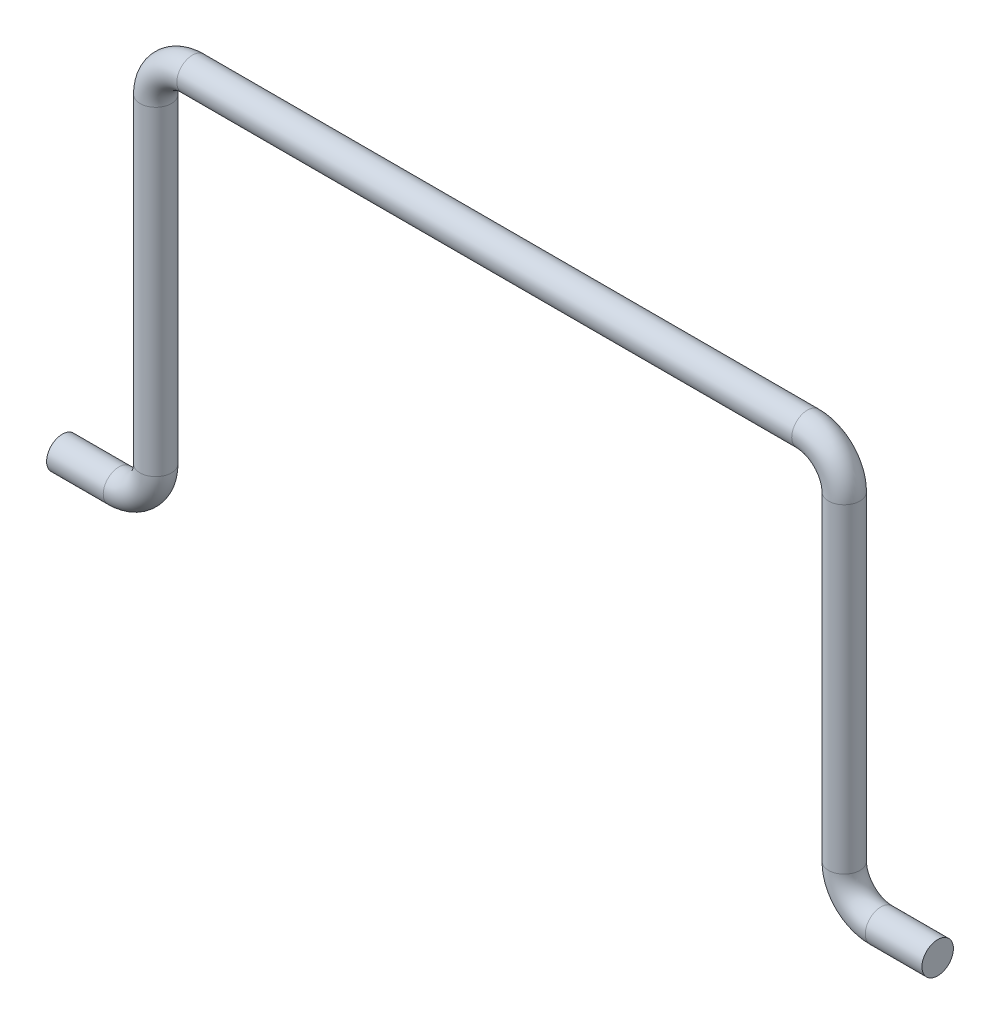
ISO-10303-21;
HEADER;
FILE_DESCRIPTION(('STEP AP214'),'2;1');
FILE_NAME('part.step','',(''),(''),'','','');
FILE_SCHEMA(('AUTOMOTIVE_DESIGN { 1 0 10303 214 1 1 1 1 }'));
ENDSEC;
DATA;
#1=APPLICATION_CONTEXT('core data for automotive mechanical design processes');
#2=APPLICATION_PROTOCOL_DEFINITION('international standard','automotive_design',2000,#1);
#3=PRODUCT_CONTEXT('',#1,'mechanical');
#4=PRODUCT('Part','Part','',(#3));
#5=PRODUCT_RELATED_PRODUCT_CATEGORY('part','',(#4));
#6=PRODUCT_DEFINITION_FORMATION('','',#4);
#7=PRODUCT_DEFINITION_CONTEXT('part definition',#1,'design');
#8=PRODUCT_DEFINITION('design','',#6,#7);
#9=PRODUCT_DEFINITION_SHAPE('','',#8);
#10=(LENGTH_UNIT() NAMED_UNIT(*) SI_UNIT(.MILLI.,.METRE.));
#11=(NAMED_UNIT(*) PLANE_ANGLE_UNIT() SI_UNIT($,.RADIAN.));
#12=(NAMED_UNIT(*) SI_UNIT($,.STERADIAN.) SOLID_ANGLE_UNIT());
#13=UNCERTAINTY_MEASURE_WITH_UNIT(LENGTH_MEASURE(1.E-05),#10,'distance_accuracy_value','');
#14=(GEOMETRIC_REPRESENTATION_CONTEXT(3) GLOBAL_UNCERTAINTY_ASSIGNED_CONTEXT((#13)) GLOBAL_UNIT_ASSIGNED_CONTEXT((#10,
#11,#12)) REPRESENTATION_CONTEXT('',''));
#15=CARTESIAN_POINT('',(0.,0.,0.));
#16=DIRECTION('',(0.,0.,1.));
#17=DIRECTION('',(1.,0.,0.));
#18=AXIS2_PLACEMENT_3D('',#15,#16,#17);
#19=CARTESIAN_POINT('',(-49.1998,0.,0.));
#20=DIRECTION('',(-1.,0.,0.));
#21=DIRECTION('',(0.,0.,1.));
#22=AXIS2_PLACEMENT_3D('',#19,#20,#21);
#23=CYLINDRICAL_SURFACE('',#22,2.032);
#24=CARTESIAN_POINT('',(-49.1998,0.,0.));
#25=DIRECTION('',(1.,0.,0.));
#26=DIRECTION('',(0.,0.,-1.));
#27=AXIS2_PLACEMENT_3D('',#24,#25,#26);
#28=CIRCLE('',#27,2.032);
#29=CARTESIAN_POINT('',(-49.1998,-2.03200000000002,0.));
#30=VERTEX_POINT('',#29);
#31=EDGE_CURVE('E38',#30,#30,#28,.T.);
#32=ORIENTED_EDGE('',*,*,#31,.F.);
#33=EDGE_LOOP('',(#32));
#34=FACE_BOUND('',#33,.T.);
#35=CARTESIAN_POINT('',(-56.515,0.,0.));
#36=DIRECTION('',(1.,0.,0.));
#37=DIRECTION('',(0.,0.,-1.));
#38=AXIS2_PLACEMENT_3D('',#35,#36,#37);
#39=CIRCLE('',#38,2.032);
#40=CARTESIAN_POINT('',(-56.515,0.,-2.032));
#41=VERTEX_POINT('',#40);
#42=EDGE_CURVE('E10',#41,#41,#39,.T.);
#43=ORIENTED_EDGE('',*,*,#42,.T.);
#44=EDGE_LOOP('',(#43));
#45=FACE_BOUND('',#44,.T.);
#46=ADVANCED_FACE('F32',(#34,#45),#23,.T.);
#47=CARTESIAN_POINT('',(-49.1998,4.7498,0.));
#48=DIRECTION('',(0.,0.,-1.));
#49=DIRECTION('',(-1.,0.,0.));
#50=AXIS2_PLACEMENT_3D('',#47,#48,#49);
#51=TOROIDAL_SURFACE('',#50,4.74980000000003,2.032);
#52=CARTESIAN_POINT('',(-44.45,4.74979999999999,0.));
#53=DIRECTION('',(0.,1.,0.));
#54=DIRECTION('',(0.,0.,-1.));
#55=AXIS2_PLACEMENT_3D('',#52,#53,#54);
#56=CIRCLE('',#55,2.032);
#57=CARTESIAN_POINT('',(-42.418,4.74979999999999,0.));
#58=VERTEX_POINT('',#57);
#59=EDGE_CURVE('E42',#58,#58,#56,.T.);
#60=CARTESIAN_POINT('',(-49.1998,4.7498,0.));
#61=DIRECTION('',(0.,0.,-1.));
#62=DIRECTION('',(-1.,0.,0.));
#63=AXIS2_PLACEMENT_3D('',#60,#61,#62);
#64=CIRCLE('',#63,6.78180000000003);
#65=EDGE_CURVE('',#58,#30,#64,.T.);
#66=ORIENTED_EDGE('',*,*,#59,.F.);
#67=ORIENTED_EDGE('',*,*,#31,.T.);
#68=ORIENTED_EDGE('',*,*,#65,.T.);
#69=ORIENTED_EDGE('',*,*,#65,.F.);
#70=EDGE_LOOP('',(#66,#68,#67,#69));
#71=FACE_BOUND('',#70,.T.);
#72=ADVANCED_FACE('F106',(#71),#51,.T.);
#73=CARTESIAN_POINT('',(-44.45,46.0502,0.));
#74=DIRECTION('',(0.,-1.,0.));
#75=DIRECTION('',(0.,0.,-1.));
#76=AXIS2_PLACEMENT_3D('',#73,#74,#75);
#77=CYLINDRICAL_SURFACE('',#76,2.032);
#78=CARTESIAN_POINT('',(-44.45,46.0502,0.));
#79=DIRECTION('',(0.,1.,0.));
#80=DIRECTION('',(0.,0.,-1.));
#81=AXIS2_PLACEMENT_3D('',#78,#79,#80);
#82=CIRCLE('',#81,2.032);
#83=CARTESIAN_POINT('',(-46.482,46.0502,0.));
#84=VERTEX_POINT('',#83);
#85=EDGE_CURVE('E46',#84,#84,#82,.T.);
#86=ORIENTED_EDGE('',*,*,#85,.F.);
#87=EDGE_LOOP('',(#86));
#88=FACE_BOUND('',#87,.T.);
#89=ORIENTED_EDGE('',*,*,#59,.T.);
#90=EDGE_LOOP('',(#89));
#91=FACE_BOUND('',#90,.T.);
#92=ADVANCED_FACE('F100',(#88,#91),#77,.T.);
#93=CARTESIAN_POINT('',(-39.7002,46.0502,0.));
#94=DIRECTION('',(0.,0.,1.));
#95=DIRECTION('',(1.,0.,0.));
#96=AXIS2_PLACEMENT_3D('',#93,#94,#95);
#97=TOROIDAL_SURFACE('',#96,4.74979999999998,2.032);
#98=CARTESIAN_POINT('',(-39.7002,50.8,0.));
#99=DIRECTION('',(1.,0.,0.));
#100=DIRECTION('',(0.,0.,-1.));
#101=AXIS2_PLACEMENT_3D('',#98,#99,#100);
#102=CIRCLE('',#101,2.032);
#103=CARTESIAN_POINT('',(-39.7002,52.832,0.));
#104=VERTEX_POINT('',#103);
#105=EDGE_CURVE('E51',#104,#104,#102,.T.);
#106=CARTESIAN_POINT('',(-39.7002,46.0502,0.));
#107=DIRECTION('',(0.,0.,1.));
#108=DIRECTION('',(1.,0.,0.));
#109=AXIS2_PLACEMENT_3D('',#106,#107,#108);
#110=CIRCLE('',#109,6.78179999999998);
#111=EDGE_CURVE('',#104,#84,#110,.T.);
#112=ORIENTED_EDGE('',*,*,#105,.F.);
#113=ORIENTED_EDGE('',*,*,#85,.T.);
#114=ORIENTED_EDGE('',*,*,#111,.T.);
#115=ORIENTED_EDGE('',*,*,#111,.F.);
#116=EDGE_LOOP('',(#112,#114,#113,#115));
#117=FACE_BOUND('',#116,.T.);
#118=ADVANCED_FACE('F94',(#117),#97,.T.);
#119=CARTESIAN_POINT('',(39.7002,50.8,0.));
#120=DIRECTION('',(-1.,0.,0.));
#121=DIRECTION('',(0.,-1.,0.));
#122=AXIS2_PLACEMENT_3D('',#119,#120,#121);
#123=CYLINDRICAL_SURFACE('',#122,2.032);
#124=CARTESIAN_POINT('',(39.7002,50.8,0.));
#125=DIRECTION('',(1.,0.,0.));
#126=DIRECTION('',(0.,0.,-1.));
#127=AXIS2_PLACEMENT_3D('',#124,#125,#126);
#128=CIRCLE('',#127,2.032);
#129=CARTESIAN_POINT('',(39.7002,52.832,0.));
#130=VERTEX_POINT('',#129);
#131=EDGE_CURVE('E54',#130,#130,#128,.T.);
#132=ORIENTED_EDGE('',*,*,#131,.F.);
#133=EDGE_LOOP('',(#132));
#134=FACE_BOUND('',#133,.T.);
#135=ORIENTED_EDGE('',*,*,#105,.T.);
#136=EDGE_LOOP('',(#135));
#137=FACE_BOUND('',#136,.T.);
#138=ADVANCED_FACE('F88',(#134,#137),#123,.T.);
#139=CARTESIAN_POINT('',(39.7002,46.0502,0.));
#140=DIRECTION('',(0.,0.,1.));
#141=DIRECTION('',(1.,0.,0.));
#142=AXIS2_PLACEMENT_3D('',#139,#140,#141);
#143=TOROIDAL_SURFACE('',#142,4.74979999999996,2.032);
#144=CARTESIAN_POINT('',(44.4499999999999,46.0502,0.));
#145=DIRECTION('',(0.,-1.,0.));
#146=DIRECTION('',(0.,0.,-1.));
#147=AXIS2_PLACEMENT_3D('',#144,#145,#146);
#148=CIRCLE('',#147,2.032);
#149=CARTESIAN_POINT('',(46.4819999999999,46.0502,0.));
#150=VERTEX_POINT('',#149);
#151=EDGE_CURVE('E57',#150,#150,#148,.T.);
#152=CARTESIAN_POINT('',(39.7002,46.0502,0.));
#153=DIRECTION('',(0.,0.,1.));
#154=DIRECTION('',(1.,0.,0.));
#155=AXIS2_PLACEMENT_3D('',#152,#153,#154);
#156=CIRCLE('',#155,6.78179999999996);
#157=EDGE_CURVE('',#150,#130,#156,.T.);
#158=ORIENTED_EDGE('',*,*,#151,.F.);
#159=ORIENTED_EDGE('',*,*,#131,.T.);
#160=ORIENTED_EDGE('',*,*,#157,.T.);
#161=ORIENTED_EDGE('',*,*,#157,.F.);
#162=EDGE_LOOP('',(#158,#160,#159,#161));
#163=FACE_BOUND('',#162,.T.);
#164=ADVANCED_FACE('F82',(#163),#143,.T.);
#165=CARTESIAN_POINT('',(44.45,4.74980000000001,0.));
#166=DIRECTION('',(0.,1.,0.));
#167=DIRECTION('',(-1.,0.,0.));
#168=AXIS2_PLACEMENT_3D('',#165,#166,#167);
#169=CYLINDRICAL_SURFACE('',#168,2.032);
#170=CARTESIAN_POINT('',(44.45,4.74980000000001,0.));
#171=DIRECTION('',(0.,-1.,0.));
#172=DIRECTION('',(0.,0.,-1.));
#173=AXIS2_PLACEMENT_3D('',#170,#171,#172);
#174=CIRCLE('',#173,2.032);
#175=CARTESIAN_POINT('',(42.418,4.74980000000001,0.));
#176=VERTEX_POINT('',#175);
#177=EDGE_CURVE('E60',#176,#176,#174,.T.);
#178=ORIENTED_EDGE('',*,*,#177,.F.);
#179=EDGE_LOOP('',(#178));
#180=FACE_BOUND('',#179,.T.);
#181=ORIENTED_EDGE('',*,*,#151,.T.);
#182=EDGE_LOOP('',(#181));
#183=FACE_BOUND('',#182,.T.);
#184=ADVANCED_FACE('F76',(#180,#183),#169,.T.);
#185=CARTESIAN_POINT('',(49.1998,4.74980000000001,0.));
#186=DIRECTION('',(0.,0.,-1.));
#187=DIRECTION('',(-1.,0.,0.));
#188=AXIS2_PLACEMENT_3D('',#185,#186,#187);
#189=TOROIDAL_SURFACE('',#188,4.74980000000001,2.032);
#190=CARTESIAN_POINT('',(49.1998,0.,0.));
#191=DIRECTION('',(1.,0.,0.));
#192=DIRECTION('',(0.,0.,-1.));
#193=AXIS2_PLACEMENT_3D('',#190,#191,#192);
#194=CIRCLE('',#193,2.032);
#195=CARTESIAN_POINT('',(49.1998,-2.032,0.));
#196=VERTEX_POINT('',#195);
#197=EDGE_CURVE('E63',#196,#196,#194,.T.);
#198=CARTESIAN_POINT('',(49.1998,4.74980000000001,0.));
#199=DIRECTION('',(0.,0.,-1.));
#200=DIRECTION('',(-1.,0.,0.));
#201=AXIS2_PLACEMENT_3D('',#198,#199,#200);
#202=CIRCLE('',#201,6.78180000000001);
#203=EDGE_CURVE('',#196,#176,#202,.T.);
#204=ORIENTED_EDGE('',*,*,#197,.F.);
#205=ORIENTED_EDGE('',*,*,#177,.T.);
#206=ORIENTED_EDGE('',*,*,#203,.T.);
#207=ORIENTED_EDGE('',*,*,#203,.F.);
#208=EDGE_LOOP('',(#204,#206,#205,#207));
#209=FACE_BOUND('',#208,.T.);
#210=ADVANCED_FACE('F73',(#209),#189,.T.);
#211=CARTESIAN_POINT('',(49.1998,0.,0.));
#212=DIRECTION('',(1.,0.,0.));
#213=DIRECTION('',(0.,1.,0.));
#214=AXIS2_PLACEMENT_3D('',#211,#212,#213);
#215=CYLINDRICAL_SURFACE('',#214,2.032);
#216=ORIENTED_EDGE('',*,*,#197,.T.);
#217=EDGE_LOOP('',(#216));
#218=FACE_BOUND('',#217,.T.);
#219=CARTESIAN_POINT('',(56.515,0.,0.));
#220=DIRECTION('',(1.,0.,0.));
#221=DIRECTION('',(0.,0.,-1.));
#222=AXIS2_PLACEMENT_3D('',#219,#220,#221);
#223=CIRCLE('',#222,2.032);
#224=CARTESIAN_POINT('',(56.515,0.,-2.032));
#225=VERTEX_POINT('',#224);
#226=EDGE_CURVE('E64',#225,#225,#223,.T.);
#227=ORIENTED_EDGE('',*,*,#226,.F.);
#228=EDGE_LOOP('',(#227));
#229=FACE_BOUND('',#228,.T.);
#230=ADVANCED_FACE('F70',(#218,#229),#215,.T.);
#231=CARTESIAN_POINT('',(-56.515,0.,0.));
#232=DIRECTION('',(1.,0.,0.));
#233=DIRECTION('',(0.,0.,-1.));
#234=AXIS2_PLACEMENT_3D('',#231,#232,#233);
#235=PLANE('',#234);
#236=ORIENTED_EDGE('',*,*,#42,.F.);
#237=EDGE_LOOP('',(#236));
#238=FACE_BOUND('',#237,.T.);
#239=ADVANCED_FACE('F118',(#238),#235,.F.);
#240=CARTESIAN_POINT('',(56.515,0.,0.));
#241=DIRECTION('',(1.,0.,0.));
#242=DIRECTION('',(0.,0.,-1.));
#243=AXIS2_PLACEMENT_3D('',#240,#241,#242);
#244=PLANE('',#243);
#245=ORIENTED_EDGE('',*,*,#226,.T.);
#246=EDGE_LOOP('',(#245));
#247=FACE_BOUND('',#246,.T.);
#248=ADVANCED_FACE('F119',(#247),#244,.T.);
#249=CLOSED_SHELL('',(#46,#72,#92,#118,#138,#164,#184,#210,#230,#239,#248));
#250=MANIFOLD_SOLID_BREP('B2',#249);
#251=ADVANCED_BREP_SHAPE_REPRESENTATION('',(#18,#250),#14);
#252=SHAPE_DEFINITION_REPRESENTATION(#9,#251);
ENDSEC;
END-ISO-10303-21;
